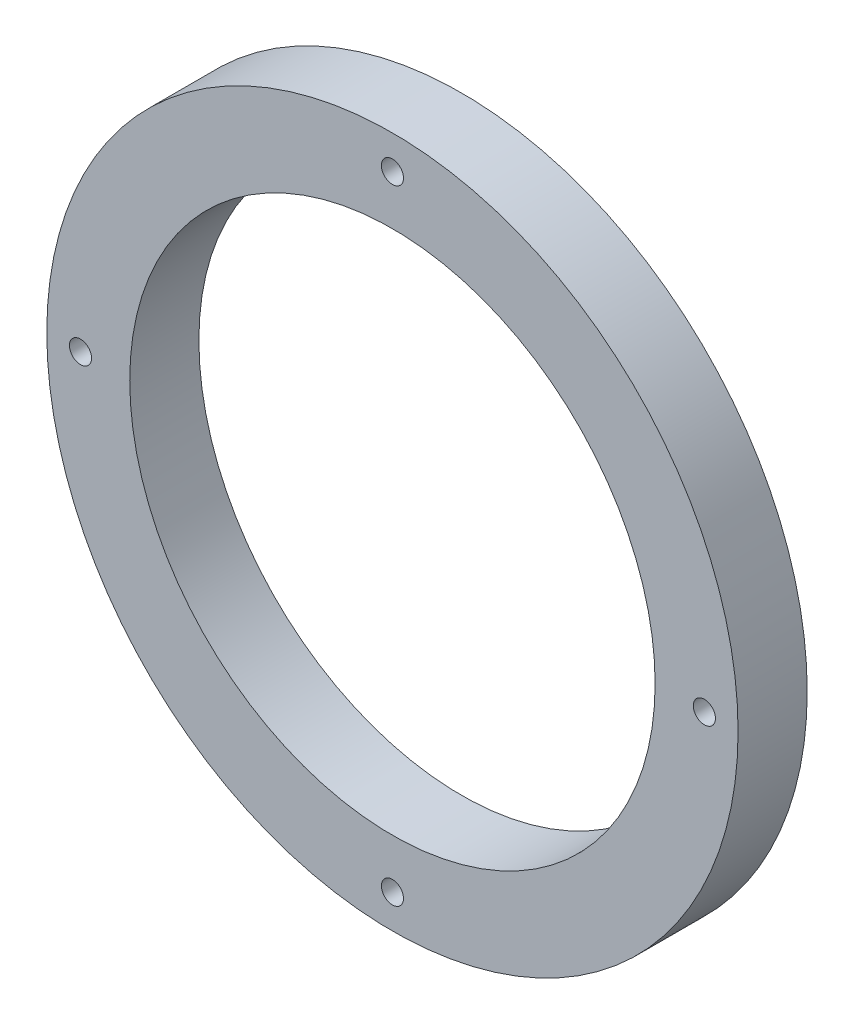
ISO-10303-21;
HEADER;
FILE_DESCRIPTION(('STEP AP214'),'2;1');
FILE_NAME('part.step','',(''),(''),'','','');
FILE_SCHEMA(('AUTOMOTIVE_DESIGN { 1 0 10303 214 1 1 1 1 }'));
ENDSEC;
DATA;
#1=APPLICATION_CONTEXT('core data for automotive mechanical design processes');
#2=APPLICATION_PROTOCOL_DEFINITION('international standard','automotive_design',2000,#1);
#3=PRODUCT_CONTEXT('',#1,'mechanical');
#4=PRODUCT('Part','Part','',(#3));
#5=PRODUCT_RELATED_PRODUCT_CATEGORY('part','',(#4));
#6=PRODUCT_DEFINITION_FORMATION('','',#4);
#7=PRODUCT_DEFINITION_CONTEXT('part definition',#1,'design');
#8=PRODUCT_DEFINITION('design','',#6,#7);
#9=PRODUCT_DEFINITION_SHAPE('','',#8);
#10=(LENGTH_UNIT() NAMED_UNIT(*) SI_UNIT(.MILLI.,.METRE.));
#11=(NAMED_UNIT(*) PLANE_ANGLE_UNIT() SI_UNIT($,.RADIAN.));
#12=(NAMED_UNIT(*) SI_UNIT($,.STERADIAN.) SOLID_ANGLE_UNIT());
#13=UNCERTAINTY_MEASURE_WITH_UNIT(LENGTH_MEASURE(1.E-05),#10,'distance_accuracy_value','');
#14=(GEOMETRIC_REPRESENTATION_CONTEXT(3) GLOBAL_UNCERTAINTY_ASSIGNED_CONTEXT((#13)) GLOBAL_UNIT_ASSIGNED_CONTEXT((#10,
#11,#12)) REPRESENTATION_CONTEXT('',''));
#15=CARTESIAN_POINT('',(0.,0.,0.));
#16=DIRECTION('',(0.,0.,1.));
#17=DIRECTION('',(1.,0.,0.));
#18=AXIS2_PLACEMENT_3D('',#15,#16,#17);
#19=CARTESIAN_POINT('',(0.,0.,10.));
#20=DIRECTION('',(0.,0.,1.));
#21=DIRECTION('',(1.,0.,0.));
#22=AXIS2_PLACEMENT_3D('',#19,#20,#21);
#23=PLANE('',#22);
#24=CARTESIAN_POINT('',(-3.15106190830593E-13,-45.125,10.));
#25=DIRECTION('',(0.,0.,1.));
#26=DIRECTION('',(1.,0.,0.));
#27=AXIS2_PLACEMENT_3D('',#24,#25,#26);
#28=CIRCLE('',#27,1.6);
#29=CARTESIAN_POINT('',(1.59999999999968,-45.125,10.));
#30=VERTEX_POINT('',#29);
#31=EDGE_CURVE('E78',#30,#30,#28,.T.);
#32=ORIENTED_EDGE('',*,*,#31,.F.);
#33=EDGE_LOOP('',(#32));
#34=FACE_BOUND('',#33,.T.);
#35=CARTESIAN_POINT('',(0.,45.125,10.));
#36=DIRECTION('',(0.,0.,1.));
#37=DIRECTION('',(1.,0.,0.));
#38=AXIS2_PLACEMENT_3D('',#35,#36,#37);
#39=CIRCLE('',#38,1.6);
#40=CARTESIAN_POINT('',(1.6,45.125,10.));
#41=VERTEX_POINT('',#40);
#42=EDGE_CURVE('E62',#41,#41,#39,.T.);
#43=ORIENTED_EDGE('',*,*,#42,.F.);
#44=EDGE_LOOP('',(#43));
#45=FACE_BOUND('',#44,.T.);
#46=CARTESIAN_POINT('',(0.,0.,10.));
#47=DIRECTION('',(0.,0.,1.));
#48=DIRECTION('',(1.,0.,0.));
#49=AXIS2_PLACEMENT_3D('',#46,#47,#48);
#50=CIRCLE('',#49,50.);
#51=CARTESIAN_POINT('',(50.,0.,10.));
#52=VERTEX_POINT('',#51);
#53=EDGE_CURVE('E10',#52,#52,#50,.T.);
#54=ORIENTED_EDGE('',*,*,#53,.T.);
#55=EDGE_LOOP('',(#54));
#56=FACE_BOUND('',#55,.T.);
#57=CARTESIAN_POINT('',(0.,0.,10.));
#58=DIRECTION('',(0.,0.,1.));
#59=DIRECTION('',(1.,0.,0.));
#60=AXIS2_PLACEMENT_3D('',#57,#58,#59);
#61=CIRCLE('',#60,38.);
#62=CARTESIAN_POINT('',(38.,0.,10.));
#63=VERTEX_POINT('',#62);
#64=EDGE_CURVE('E56',#63,#63,#61,.T.);
#65=ORIENTED_EDGE('',*,*,#64,.F.);
#66=EDGE_LOOP('',(#65));
#67=FACE_BOUND('',#66,.T.);
#68=CARTESIAN_POINT('',(45.125,-1.57553095415296E-13,10.));
#69=DIRECTION('',(0.,0.,1.));
#70=DIRECTION('',(1.,0.,0.));
#71=AXIS2_PLACEMENT_3D('',#68,#69,#70);
#72=CIRCLE('',#71,1.6);
#73=CARTESIAN_POINT('',(46.725,-1.57553095415296E-13,10.));
#74=VERTEX_POINT('',#73);
#75=EDGE_CURVE('E70',#74,#74,#72,.T.);
#76=ORIENTED_EDGE('',*,*,#75,.F.);
#77=EDGE_LOOP('',(#76));
#78=FACE_BOUND('',#77,.T.);
#79=CARTESIAN_POINT('',(-45.125,4.72659286245889E-13,10.));
#80=DIRECTION('',(0.,0.,1.));
#81=DIRECTION('',(1.,0.,0.));
#82=AXIS2_PLACEMENT_3D('',#79,#80,#81);
#83=CIRCLE('',#82,1.6);
#84=CARTESIAN_POINT('',(-43.525,4.72659286245889E-13,10.));
#85=VERTEX_POINT('',#84);
#86=EDGE_CURVE('E86',#85,#85,#83,.T.);
#87=ORIENTED_EDGE('',*,*,#86,.F.);
#88=EDGE_LOOP('',(#87));
#89=FACE_BOUND('',#88,.T.);
#90=ADVANCED_FACE('F43',(#34,#45,#56,#67,#78,#89),#23,.T.);
#91=CARTESIAN_POINT('',(0.,0.,0.));
#92=DIRECTION('',(0.,0.,1.));
#93=DIRECTION('',(1.,0.,0.));
#94=AXIS2_PLACEMENT_3D('',#91,#92,#93);
#95=PLANE('',#94);
#96=CARTESIAN_POINT('',(0.,0.,0.));
#97=DIRECTION('',(0.,0.,1.));
#98=DIRECTION('',(1.,0.,0.));
#99=AXIS2_PLACEMENT_3D('',#96,#97,#98);
#100=CIRCLE('',#99,50.);
#101=CARTESIAN_POINT('',(50.,0.,0.));
#102=VERTEX_POINT('',#101);
#103=EDGE_CURVE('E47',#102,#102,#100,.T.);
#104=ORIENTED_EDGE('',*,*,#103,.F.);
#105=EDGE_LOOP('',(#104));
#106=FACE_BOUND('',#105,.T.);
#107=CARTESIAN_POINT('',(0.,0.,0.));
#108=DIRECTION('',(0.,0.,1.));
#109=DIRECTION('',(1.,0.,0.));
#110=AXIS2_PLACEMENT_3D('',#107,#108,#109);
#111=CIRCLE('',#110,38.);
#112=CARTESIAN_POINT('',(38.,0.,0.));
#113=VERTEX_POINT('',#112);
#114=EDGE_CURVE('E58',#113,#113,#111,.T.);
#115=ORIENTED_EDGE('',*,*,#114,.T.);
#116=EDGE_LOOP('',(#115));
#117=FACE_BOUND('',#116,.T.);
#118=CARTESIAN_POINT('',(0.,45.125,0.));
#119=DIRECTION('',(0.,0.,1.));
#120=DIRECTION('',(1.,0.,0.));
#121=AXIS2_PLACEMENT_3D('',#118,#119,#120);
#122=CIRCLE('',#121,1.6);
#123=CARTESIAN_POINT('',(1.6,45.125,0.));
#124=VERTEX_POINT('',#123);
#125=EDGE_CURVE('E66',#124,#124,#122,.T.);
#126=ORIENTED_EDGE('',*,*,#125,.T.);
#127=EDGE_LOOP('',(#126));
#128=FACE_BOUND('',#127,.T.);
#129=CARTESIAN_POINT('',(45.125,-1.57553095415296E-13,0.));
#130=DIRECTION('',(0.,0.,1.));
#131=DIRECTION('',(1.,0.,0.));
#132=AXIS2_PLACEMENT_3D('',#129,#130,#131);
#133=CIRCLE('',#132,1.6);
#134=CARTESIAN_POINT('',(46.725,-1.57553095415296E-13,0.));
#135=VERTEX_POINT('',#134);
#136=EDGE_CURVE('E74',#135,#135,#133,.T.);
#137=ORIENTED_EDGE('',*,*,#136,.T.);
#138=EDGE_LOOP('',(#137));
#139=FACE_BOUND('',#138,.T.);
#140=CARTESIAN_POINT('',(-3.15106190830593E-13,-45.125,0.));
#141=DIRECTION('',(0.,0.,1.));
#142=DIRECTION('',(1.,0.,0.));
#143=AXIS2_PLACEMENT_3D('',#140,#141,#142);
#144=CIRCLE('',#143,1.6);
#145=CARTESIAN_POINT('',(1.59999999999968,-45.125,0.));
#146=VERTEX_POINT('',#145);
#147=EDGE_CURVE('E82',#146,#146,#144,.T.);
#148=ORIENTED_EDGE('',*,*,#147,.T.);
#149=EDGE_LOOP('',(#148));
#150=FACE_BOUND('',#149,.T.);
#151=CARTESIAN_POINT('',(-45.125,4.72659286245889E-13,0.));
#152=DIRECTION('',(0.,0.,1.));
#153=DIRECTION('',(1.,0.,0.));
#154=AXIS2_PLACEMENT_3D('',#151,#152,#153);
#155=CIRCLE('',#154,1.6);
#156=CARTESIAN_POINT('',(-43.525,4.72659286245889E-13,0.));
#157=VERTEX_POINT('',#156);
#158=EDGE_CURVE('E90',#157,#157,#155,.T.);
#159=ORIENTED_EDGE('',*,*,#158,.T.);
#160=EDGE_LOOP('',(#159));
#161=FACE_BOUND('',#160,.T.);
#162=ADVANCED_FACE('F102',(#106,#117,#128,#139,#150,#161),#95,.F.);
#163=CARTESIAN_POINT('',(0.,0.,10.));
#164=DIRECTION('',(0.,0.,-1.));
#165=DIRECTION('',(-1.,0.,0.));
#166=AXIS2_PLACEMENT_3D('',#163,#164,#165);
#167=CYLINDRICAL_SURFACE('',#166,50.);
#168=ORIENTED_EDGE('',*,*,#53,.F.);
#169=EDGE_LOOP('',(#168));
#170=FACE_BOUND('',#169,.T.);
#171=ORIENTED_EDGE('',*,*,#103,.T.);
#172=EDGE_LOOP('',(#171));
#173=FACE_BOUND('',#172,.T.);
#174=ADVANCED_FACE('F45',(#170,#173),#167,.T.);
#175=CARTESIAN_POINT('',(0.,0.,10.));
#176=DIRECTION('',(0.,0.,-1.));
#177=DIRECTION('',(-1.,0.,0.));
#178=AXIS2_PLACEMENT_3D('',#175,#176,#177);
#179=CYLINDRICAL_SURFACE('',#178,38.);
#180=ORIENTED_EDGE('',*,*,#64,.T.);
#181=EDGE_LOOP('',(#180));
#182=FACE_BOUND('',#181,.T.);
#183=ORIENTED_EDGE('',*,*,#114,.F.);
#184=EDGE_LOOP('',(#183));
#185=FACE_BOUND('',#184,.T.);
#186=ADVANCED_FACE('F112',(#182,#185),#179,.F.);
#187=CARTESIAN_POINT('',(0.,45.125,10.));
#188=DIRECTION('',(0.,0.,-1.));
#189=DIRECTION('',(-1.,0.,0.));
#190=AXIS2_PLACEMENT_3D('',#187,#188,#189);
#191=CYLINDRICAL_SURFACE('',#190,1.6);
#192=ORIENTED_EDGE('',*,*,#42,.T.);
#193=EDGE_LOOP('',(#192));
#194=FACE_BOUND('',#193,.T.);
#195=ORIENTED_EDGE('',*,*,#125,.F.);
#196=EDGE_LOOP('',(#195));
#197=FACE_BOUND('',#196,.T.);
#198=ADVANCED_FACE('F115',(#194,#197),#191,.F.);
#199=CARTESIAN_POINT('',(45.125,-1.57553095415296E-13,10.));
#200=DIRECTION('',(0.,0.,-1.));
#201=DIRECTION('',(-1.,0.,0.));
#202=AXIS2_PLACEMENT_3D('',#199,#200,#201);
#203=CYLINDRICAL_SURFACE('',#202,1.6);
#204=ORIENTED_EDGE('',*,*,#75,.T.);
#205=EDGE_LOOP('',(#204));
#206=FACE_BOUND('',#205,.T.);
#207=ORIENTED_EDGE('',*,*,#136,.F.);
#208=EDGE_LOOP('',(#207));
#209=FACE_BOUND('',#208,.T.);
#210=ADVANCED_FACE('F119',(#206,#209),#203,.F.);
#211=CARTESIAN_POINT('',(-3.15106190830593E-13,-45.125,10.));
#212=DIRECTION('',(0.,0.,-1.));
#213=DIRECTION('',(-1.,0.,0.));
#214=AXIS2_PLACEMENT_3D('',#211,#212,#213);
#215=CYLINDRICAL_SURFACE('',#214,1.6);
#216=ORIENTED_EDGE('',*,*,#31,.T.);
#217=EDGE_LOOP('',(#216));
#218=FACE_BOUND('',#217,.T.);
#219=ORIENTED_EDGE('',*,*,#147,.F.);
#220=EDGE_LOOP('',(#219));
#221=FACE_BOUND('',#220,.T.);
#222=ADVANCED_FACE('F123',(#218,#221),#215,.F.);
#223=CARTESIAN_POINT('',(-45.125,4.72659286245889E-13,10.));
#224=DIRECTION('',(0.,0.,-1.));
#225=DIRECTION('',(-1.,0.,0.));
#226=AXIS2_PLACEMENT_3D('',#223,#224,#225);
#227=CYLINDRICAL_SURFACE('',#226,1.6);
#228=ORIENTED_EDGE('',*,*,#86,.T.);
#229=EDGE_LOOP('',(#228));
#230=FACE_BOUND('',#229,.T.);
#231=ORIENTED_EDGE('',*,*,#158,.F.);
#232=EDGE_LOOP('',(#231));
#233=FACE_BOUND('',#232,.T.);
#234=ADVANCED_FACE('F98',(#230,#233),#227,.F.);
#235=CLOSED_SHELL('',(#90,#162,#174,#186,#198,#210,#222,#234));
#236=MANIFOLD_SOLID_BREP('B2',#235);
#237=ADVANCED_BREP_SHAPE_REPRESENTATION('',(#18,#236),#14);
#238=SHAPE_DEFINITION_REPRESENTATION(#9,#237);
ENDSEC;
END-ISO-10303-21;
